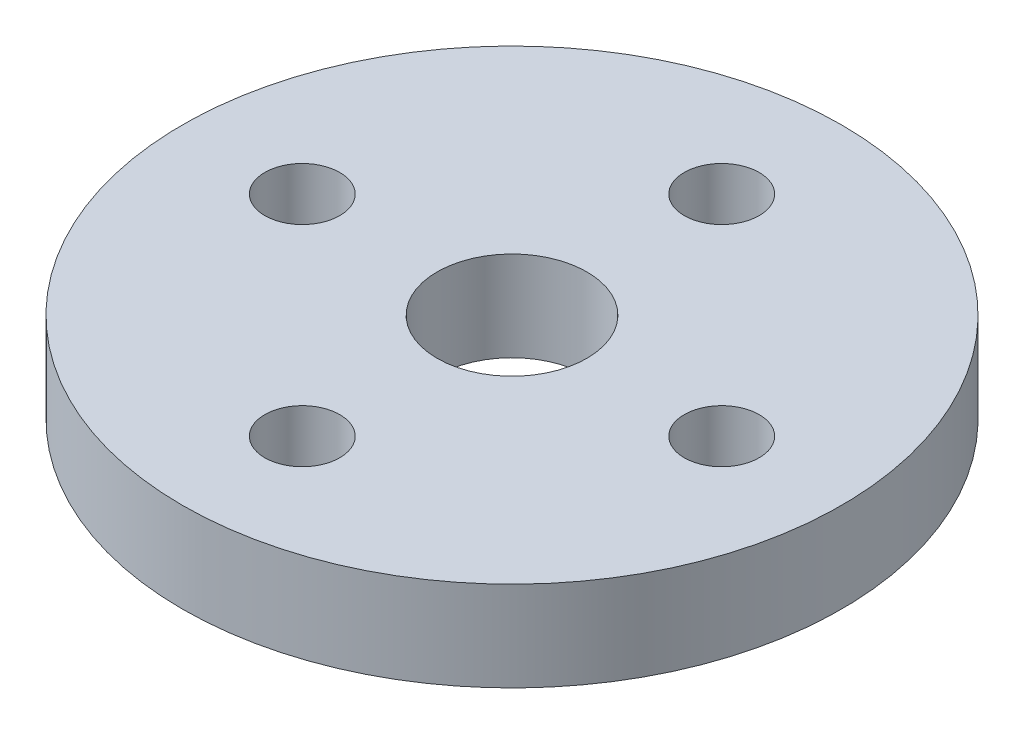
ISO-10303-21;
HEADER;
FILE_DESCRIPTION(('STEP AP214'),'2;1');
FILE_NAME('part.step','',(''),(''),'','','');
FILE_SCHEMA(('AUTOMOTIVE_DESIGN { 1 0 10303 214 1 1 1 1 }'));
ENDSEC;
DATA;
#1=APPLICATION_CONTEXT('core data for automotive mechanical design processes');
#2=APPLICATION_PROTOCOL_DEFINITION('international standard','automotive_design',2000,#1);
#3=PRODUCT_CONTEXT('',#1,'mechanical');
#4=PRODUCT('Part','Part','',(#3));
#5=PRODUCT_RELATED_PRODUCT_CATEGORY('part','',(#4));
#6=PRODUCT_DEFINITION_FORMATION('','',#4);
#7=PRODUCT_DEFINITION_CONTEXT('part definition',#1,'design');
#8=PRODUCT_DEFINITION('design','',#6,#7);
#9=PRODUCT_DEFINITION_SHAPE('','',#8);
#10=(LENGTH_UNIT() NAMED_UNIT(*) SI_UNIT(.MILLI.,.METRE.));
#11=(NAMED_UNIT(*) PLANE_ANGLE_UNIT() SI_UNIT($,.RADIAN.));
#12=(NAMED_UNIT(*) SI_UNIT($,.STERADIAN.) SOLID_ANGLE_UNIT());
#13=UNCERTAINTY_MEASURE_WITH_UNIT(LENGTH_MEASURE(1.E-05),#10,'distance_accuracy_value','');
#14=(GEOMETRIC_REPRESENTATION_CONTEXT(3) GLOBAL_UNCERTAINTY_ASSIGNED_CONTEXT((#13)) GLOBAL_UNIT_ASSIGNED_CONTEXT((#10,
#11,#12)) REPRESENTATION_CONTEXT('',''));
#15=CARTESIAN_POINT('',(0.,0.,0.));
#16=DIRECTION('',(0.,0.,1.));
#17=DIRECTION('',(1.,0.,0.));
#18=AXIS2_PLACEMENT_3D('',#15,#16,#17);
#19=CARTESIAN_POINT('',(0.,3.,0.));
#20=DIRECTION('',(0.,1.,0.));
#21=DIRECTION('',(0.,0.,1.));
#22=AXIS2_PLACEMENT_3D('',#19,#20,#21);
#23=PLANE('',#22);
#24=CARTESIAN_POINT('',(0.,3.,7.));
#25=DIRECTION('',(0.,1.,0.));
#26=DIRECTION('',(0.,0.,1.));
#27=AXIS2_PLACEMENT_3D('',#24,#25,#26);
#28=CIRCLE('',#27,1.25);
#29=CARTESIAN_POINT('',(0.,3.,8.25));
#30=VERTEX_POINT('',#29);
#31=EDGE_CURVE('E64',#30,#30,#28,.T.);
#32=ORIENTED_EDGE('',*,*,#31,.F.);
#33=EDGE_LOOP('',(#32));
#34=FACE_BOUND('',#33,.T.);
#35=CARTESIAN_POINT('',(0.,3.,-7.));
#36=DIRECTION('',(0.,1.,0.));
#37=DIRECTION('',(0.,0.,1.));
#38=AXIS2_PLACEMENT_3D('',#35,#36,#37);
#39=CIRCLE('',#38,1.25);
#40=CARTESIAN_POINT('',(0.,3.,-5.75));
#41=VERTEX_POINT('',#40);
#42=EDGE_CURVE('E52',#41,#41,#39,.T.);
#43=ORIENTED_EDGE('',*,*,#42,.F.);
#44=EDGE_LOOP('',(#43));
#45=FACE_BOUND('',#44,.T.);
#46=CARTESIAN_POINT('',(0.,3.,0.));
#47=DIRECTION('',(0.,1.,0.));
#48=DIRECTION('',(0.,0.,1.));
#49=AXIS2_PLACEMENT_3D('',#46,#47,#48);
#50=CIRCLE('',#49,11.);
#51=CARTESIAN_POINT('',(0.,3.,11.));
#52=VERTEX_POINT('',#51);
#53=EDGE_CURVE('E10',#52,#52,#50,.T.);
#54=ORIENTED_EDGE('',*,*,#53,.T.);
#55=EDGE_LOOP('',(#54));
#56=FACE_BOUND('',#55,.T.);
#57=CARTESIAN_POINT('',(0.,3.,0.));
#58=DIRECTION('',(0.,1.,0.));
#59=DIRECTION('',(0.,0.,1.));
#60=AXIS2_PLACEMENT_3D('',#57,#58,#59);
#61=CIRCLE('',#60,2.5);
#62=CARTESIAN_POINT('',(0.,3.,2.5));
#63=VERTEX_POINT('',#62);
#64=EDGE_CURVE('E47',#63,#63,#61,.T.);
#65=ORIENTED_EDGE('',*,*,#64,.F.);
#66=EDGE_LOOP('',(#65));
#67=FACE_BOUND('',#66,.T.);
#68=CARTESIAN_POINT('',(7.,3.,0.));
#69=DIRECTION('',(0.,1.,0.));
#70=DIRECTION('',(0.,0.,1.));
#71=AXIS2_PLACEMENT_3D('',#68,#69,#70);
#72=CIRCLE('',#71,1.25);
#73=CARTESIAN_POINT('',(7.,3.,1.25));
#74=VERTEX_POINT('',#73);
#75=EDGE_CURVE('E58',#74,#74,#72,.T.);
#76=ORIENTED_EDGE('',*,*,#75,.F.);
#77=EDGE_LOOP('',(#76));
#78=FACE_BOUND('',#77,.T.);
#79=CARTESIAN_POINT('',(-7.,3.,0.));
#80=DIRECTION('',(0.,1.,0.));
#81=DIRECTION('',(0.,0.,1.));
#82=AXIS2_PLACEMENT_3D('',#79,#80,#81);
#83=CIRCLE('',#82,1.25);
#84=CARTESIAN_POINT('',(-7.,3.,1.25));
#85=VERTEX_POINT('',#84);
#86=EDGE_CURVE('E70',#85,#85,#83,.T.);
#87=ORIENTED_EDGE('',*,*,#86,.F.);
#88=EDGE_LOOP('',(#87));
#89=FACE_BOUND('',#88,.T.);
#90=ADVANCED_FACE('F36',(#34,#45,#56,#67,#78,#89),#23,.T.);
#91=CARTESIAN_POINT('',(0.,0.,0.));
#92=DIRECTION('',(0.,1.,0.));
#93=DIRECTION('',(0.,0.,1.));
#94=AXIS2_PLACEMENT_3D('',#91,#92,#93);
#95=PLANE('',#94);
#96=CARTESIAN_POINT('',(0.,0.,0.));
#97=DIRECTION('',(0.,1.,0.));
#98=DIRECTION('',(0.,0.,1.));
#99=AXIS2_PLACEMENT_3D('',#96,#97,#98);
#100=CIRCLE('',#99,11.);
#101=CARTESIAN_POINT('',(0.,0.,11.));
#102=VERTEX_POINT('',#101);
#103=EDGE_CURVE('E40',#102,#102,#100,.T.);
#104=ORIENTED_EDGE('',*,*,#103,.F.);
#105=EDGE_LOOP('',(#104));
#106=FACE_BOUND('',#105,.T.);
#107=CARTESIAN_POINT('',(0.,0.,0.));
#108=DIRECTION('',(0.,1.,0.));
#109=DIRECTION('',(0.,0.,1.));
#110=AXIS2_PLACEMENT_3D('',#107,#108,#109);
#111=CIRCLE('',#110,2.5);
#112=CARTESIAN_POINT('',(0.,0.,2.5));
#113=VERTEX_POINT('',#112);
#114=EDGE_CURVE('E49',#113,#113,#111,.T.);
#115=ORIENTED_EDGE('',*,*,#114,.T.);
#116=EDGE_LOOP('',(#115));
#117=FACE_BOUND('',#116,.T.);
#118=CARTESIAN_POINT('',(0.,0.,-7.));
#119=DIRECTION('',(0.,1.,0.));
#120=DIRECTION('',(0.,0.,1.));
#121=AXIS2_PLACEMENT_3D('',#118,#119,#120);
#122=CIRCLE('',#121,1.25);
#123=CARTESIAN_POINT('',(0.,0.,-5.75));
#124=VERTEX_POINT('',#123);
#125=EDGE_CURVE('E55',#124,#124,#122,.T.);
#126=ORIENTED_EDGE('',*,*,#125,.T.);
#127=EDGE_LOOP('',(#126));
#128=FACE_BOUND('',#127,.T.);
#129=CARTESIAN_POINT('',(7.,0.,0.));
#130=DIRECTION('',(0.,1.,0.));
#131=DIRECTION('',(0.,0.,1.));
#132=AXIS2_PLACEMENT_3D('',#129,#130,#131);
#133=CIRCLE('',#132,1.25);
#134=CARTESIAN_POINT('',(7.,0.,1.25));
#135=VERTEX_POINT('',#134);
#136=EDGE_CURVE('E61',#135,#135,#133,.T.);
#137=ORIENTED_EDGE('',*,*,#136,.T.);
#138=EDGE_LOOP('',(#137));
#139=FACE_BOUND('',#138,.T.);
#140=CARTESIAN_POINT('',(0.,0.,7.));
#141=DIRECTION('',(0.,1.,0.));
#142=DIRECTION('',(0.,0.,1.));
#143=AXIS2_PLACEMENT_3D('',#140,#141,#142);
#144=CIRCLE('',#143,1.25);
#145=CARTESIAN_POINT('',(0.,0.,8.25));
#146=VERTEX_POINT('',#145);
#147=EDGE_CURVE('E67',#146,#146,#144,.T.);
#148=ORIENTED_EDGE('',*,*,#147,.T.);
#149=EDGE_LOOP('',(#148));
#150=FACE_BOUND('',#149,.T.);
#151=CARTESIAN_POINT('',(-7.,0.,0.));
#152=DIRECTION('',(0.,1.,0.));
#153=DIRECTION('',(0.,0.,1.));
#154=AXIS2_PLACEMENT_3D('',#151,#152,#153);
#155=CIRCLE('',#154,1.25);
#156=CARTESIAN_POINT('',(-7.,0.,1.25));
#157=VERTEX_POINT('',#156);
#158=EDGE_CURVE('E73',#157,#157,#155,.T.);
#159=ORIENTED_EDGE('',*,*,#158,.T.);
#160=EDGE_LOOP('',(#159));
#161=FACE_BOUND('',#160,.T.);
#162=ADVANCED_FACE('F83',(#106,#117,#128,#139,#150,#161),#95,.F.);
#163=CARTESIAN_POINT('',(0.,3.,0.));
#164=DIRECTION('',(0.,-1.,0.));
#165=DIRECTION('',(0.,0.,-1.));
#166=AXIS2_PLACEMENT_3D('',#163,#164,#165);
#167=CYLINDRICAL_SURFACE('',#166,11.);
#168=ORIENTED_EDGE('',*,*,#53,.F.);
#169=EDGE_LOOP('',(#168));
#170=FACE_BOUND('',#169,.T.);
#171=ORIENTED_EDGE('',*,*,#103,.T.);
#172=EDGE_LOOP('',(#171));
#173=FACE_BOUND('',#172,.T.);
#174=ADVANCED_FACE('F38',(#170,#173),#167,.T.);
#175=CARTESIAN_POINT('',(0.,3.,0.));
#176=DIRECTION('',(0.,-1.,0.));
#177=DIRECTION('',(0.,0.,-1.));
#178=AXIS2_PLACEMENT_3D('',#175,#176,#177);
#179=CYLINDRICAL_SURFACE('',#178,2.5);
#180=ORIENTED_EDGE('',*,*,#64,.T.);
#181=EDGE_LOOP('',(#180));
#182=FACE_BOUND('',#181,.T.);
#183=ORIENTED_EDGE('',*,*,#114,.F.);
#184=EDGE_LOOP('',(#183));
#185=FACE_BOUND('',#184,.T.);
#186=ADVANCED_FACE('F93',(#182,#185),#179,.F.);
#187=CARTESIAN_POINT('',(0.,3.,-7.));
#188=DIRECTION('',(0.,-1.,0.));
#189=DIRECTION('',(0.,0.,-1.));
#190=AXIS2_PLACEMENT_3D('',#187,#188,#189);
#191=CYLINDRICAL_SURFACE('',#190,1.25);
#192=ORIENTED_EDGE('',*,*,#42,.T.);
#193=EDGE_LOOP('',(#192));
#194=FACE_BOUND('',#193,.T.);
#195=ORIENTED_EDGE('',*,*,#125,.F.);
#196=EDGE_LOOP('',(#195));
#197=FACE_BOUND('',#196,.T.);
#198=ADVANCED_FACE('F96',(#194,#197),#191,.F.);
#199=CARTESIAN_POINT('',(7.,3.,0.));
#200=DIRECTION('',(0.,-1.,0.));
#201=DIRECTION('',(0.,0.,-1.));
#202=AXIS2_PLACEMENT_3D('',#199,#200,#201);
#203=CYLINDRICAL_SURFACE('',#202,1.25);
#204=ORIENTED_EDGE('',*,*,#75,.T.);
#205=EDGE_LOOP('',(#204));
#206=FACE_BOUND('',#205,.T.);
#207=ORIENTED_EDGE('',*,*,#136,.F.);
#208=EDGE_LOOP('',(#207));
#209=FACE_BOUND('',#208,.T.);
#210=ADVANCED_FACE('F100',(#206,#209),#203,.F.);
#211=CARTESIAN_POINT('',(0.,3.,7.));
#212=DIRECTION('',(0.,-1.,0.));
#213=DIRECTION('',(0.,0.,-1.));
#214=AXIS2_PLACEMENT_3D('',#211,#212,#213);
#215=CYLINDRICAL_SURFACE('',#214,1.25);
#216=ORIENTED_EDGE('',*,*,#31,.T.);
#217=EDGE_LOOP('',(#216));
#218=FACE_BOUND('',#217,.T.);
#219=ORIENTED_EDGE('',*,*,#147,.F.);
#220=EDGE_LOOP('',(#219));
#221=FACE_BOUND('',#220,.T.);
#222=ADVANCED_FACE('F104',(#218,#221),#215,.F.);
#223=CARTESIAN_POINT('',(-7.,3.,0.));
#224=DIRECTION('',(0.,-1.,0.));
#225=DIRECTION('',(0.,0.,-1.));
#226=AXIS2_PLACEMENT_3D('',#223,#224,#225);
#227=CYLINDRICAL_SURFACE('',#226,1.25);
#228=ORIENTED_EDGE('',*,*,#86,.T.);
#229=EDGE_LOOP('',(#228));
#230=FACE_BOUND('',#229,.T.);
#231=ORIENTED_EDGE('',*,*,#158,.F.);
#232=EDGE_LOOP('',(#231));
#233=FACE_BOUND('',#232,.T.);
#234=ADVANCED_FACE('F79',(#230,#233),#227,.F.);
#235=CLOSED_SHELL('',(#90,#162,#174,#186,#198,#210,#222,#234));
#236=MANIFOLD_SOLID_BREP('B2',#235);
#237=ADVANCED_BREP_SHAPE_REPRESENTATION('',(#18,#236),#14);
#238=SHAPE_DEFINITION_REPRESENTATION(#9,#237);
ENDSEC;
END-ISO-10303-21;
